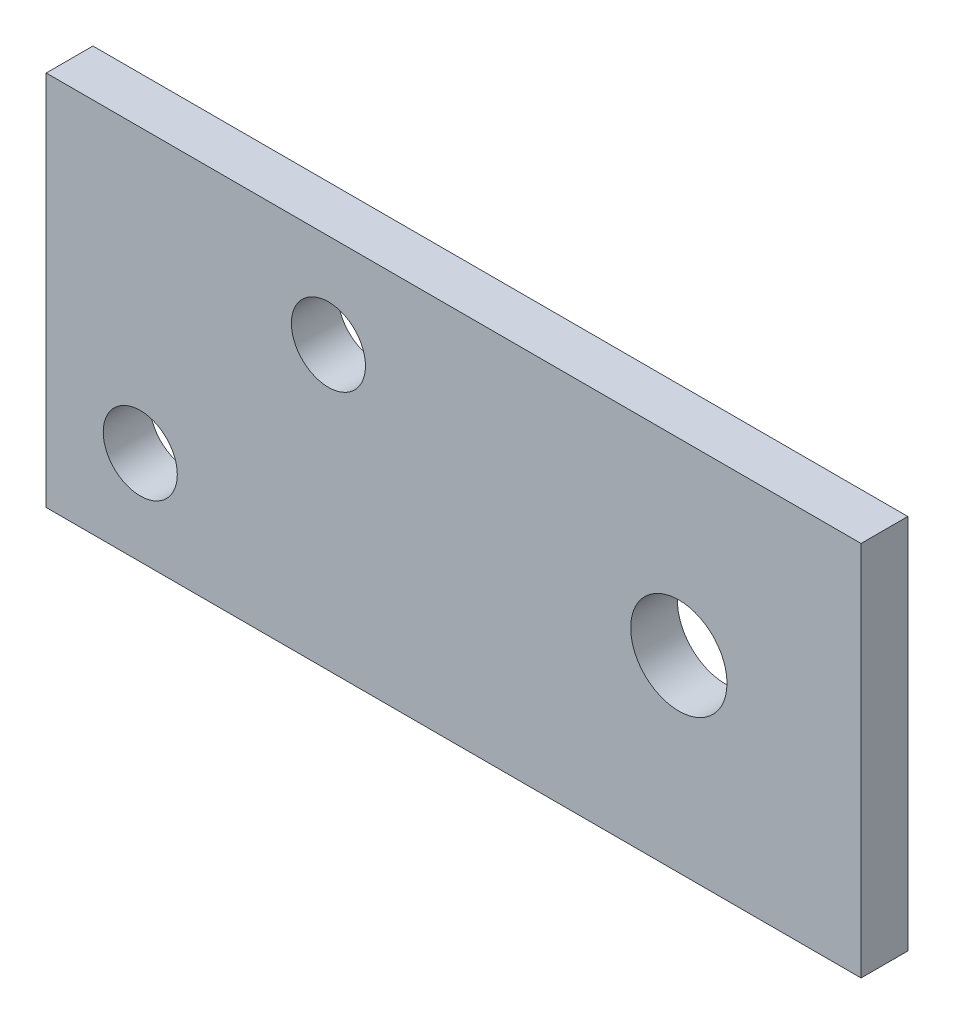
ISO-10303-21;
HEADER;
FILE_DESCRIPTION(('STEP AP214'),'2;1');
FILE_NAME('part.step','',(''),(''),'','','');
FILE_SCHEMA(('AUTOMOTIVE_DESIGN { 1 0 10303 214 1 1 1 1 }'));
ENDSEC;
DATA;
#1=APPLICATION_CONTEXT('core data for automotive mechanical design processes');
#2=APPLICATION_PROTOCOL_DEFINITION('international standard','automotive_design',2000,#1);
#3=PRODUCT_CONTEXT('',#1,'mechanical');
#4=PRODUCT('Part','Part','',(#3));
#5=PRODUCT_RELATED_PRODUCT_CATEGORY('part','',(#4));
#6=PRODUCT_DEFINITION_FORMATION('','',#4);
#7=PRODUCT_DEFINITION_CONTEXT('part definition',#1,'design');
#8=PRODUCT_DEFINITION('design','',#6,#7);
#9=PRODUCT_DEFINITION_SHAPE('','',#8);
#10=(LENGTH_UNIT() NAMED_UNIT(*) SI_UNIT(.MILLI.,.METRE.));
#11=(NAMED_UNIT(*) PLANE_ANGLE_UNIT() SI_UNIT($,.RADIAN.));
#12=(NAMED_UNIT(*) SI_UNIT($,.STERADIAN.) SOLID_ANGLE_UNIT());
#13=UNCERTAINTY_MEASURE_WITH_UNIT(LENGTH_MEASURE(1.E-05),#10,'distance_accuracy_value','');
#14=(GEOMETRIC_REPRESENTATION_CONTEXT(3) GLOBAL_UNCERTAINTY_ASSIGNED_CONTEXT((#13)) GLOBAL_UNIT_ASSIGNED_CONTEXT((#10,
#11,#12)) REPRESENTATION_CONTEXT('',''));
#15=CARTESIAN_POINT('',(0.,0.,0.));
#16=DIRECTION('',(0.,0.,1.));
#17=DIRECTION('',(1.,0.,0.));
#18=AXIS2_PLACEMENT_3D('',#15,#16,#17);
#19=CARTESIAN_POINT('',(0.,0.,6.31));
#20=DIRECTION('',(0.,0.,1.));
#21=DIRECTION('',(1.,0.,0.));
#22=AXIS2_PLACEMENT_3D('',#19,#20,#21);
#23=PLANE('',#22);
#24=CARTESIAN_POINT('',(-71.9,38.1,6.31));
#25=DIRECTION('',(0.,0.,1.));
#26=DIRECTION('',(1.,0.,0.));
#27=AXIS2_PLACEMENT_3D('',#24,#25,#26);
#28=CIRCLE('',#27,5.00000000000001);
#29=CARTESIAN_POINT('',(-66.9,38.1,6.31));
#30=VERTEX_POINT('',#29);
#31=EDGE_CURVE('E126',#30,#30,#28,.T.);
#32=ORIENTED_EDGE('',*,*,#31,.F.);
#33=EDGE_LOOP('',(#32));
#34=FACE_BOUND('',#33,.T.);
#35=CARTESIAN_POINT('',(-97.3,12.7,6.31));
#36=DIRECTION('',(0.,0.,1.));
#37=DIRECTION('',(1.,0.,0.));
#38=AXIS2_PLACEMENT_3D('',#35,#36,#37);
#39=CIRCLE('',#38,5.);
#40=CARTESIAN_POINT('',(-92.3,12.7,6.31));
#41=VERTEX_POINT('',#40);
#42=EDGE_CURVE('E116',#41,#41,#39,.T.);
#43=ORIENTED_EDGE('',*,*,#42,.F.);
#44=EDGE_LOOP('',(#43));
#45=FACE_BOUND('',#44,.T.);
#46=DIRECTION('',(-1.,0.,0.));
#47=VECTOR('',#46,1.);
#48=CARTESIAN_POINT('',(0.,50.8,6.31));
#49=LINE('',#48,#47);
#50=CARTESIAN_POINT('',(0.,50.8,6.31));
#51=VERTEX_POINT('',#50);
#52=CARTESIAN_POINT('',(-110.,50.8,6.31));
#53=VERTEX_POINT('',#52);
#54=EDGE_CURVE('E78',#51,#53,#49,.T.);
#55=ORIENTED_EDGE('',*,*,#54,.T.);
#56=DIRECTION('',(0.,-1.,0.));
#57=VECTOR('',#56,1.);
#58=CARTESIAN_POINT('',(-110.,50.8,6.31));
#59=LINE('',#58,#57);
#60=CARTESIAN_POINT('',(-110.,0.,6.31));
#61=VERTEX_POINT('',#60);
#62=EDGE_CURVE('E81',#53,#61,#59,.T.);
#63=ORIENTED_EDGE('',*,*,#62,.T.);
#64=DIRECTION('',(1.,0.,0.));
#65=VECTOR('',#64,1.);
#66=CARTESIAN_POINT('',(-110.,0.,6.31));
#67=LINE('',#66,#65);
#68=CARTESIAN_POINT('',(0.,0.,6.31));
#69=VERTEX_POINT('',#68);
#70=EDGE_CURVE('E85',#61,#69,#67,.T.);
#71=ORIENTED_EDGE('',*,*,#70,.T.);
#72=DIRECTION('',(0.,1.,0.));
#73=VECTOR('',#72,1.);
#74=CARTESIAN_POINT('',(0.,0.,6.31));
#75=LINE('',#74,#73);
#76=EDGE_CURVE('E49',#69,#51,#75,.T.);
#77=ORIENTED_EDGE('',*,*,#76,.T.);
#78=EDGE_LOOP('',(#55,#63,#71,#77));
#79=FACE_BOUND('',#78,.T.);
#80=CARTESIAN_POINT('',(-24.5999999998908,25.4013417539825,6.31));
#81=DIRECTION('',(0.,0.,1.));
#82=DIRECTION('',(1.,0.,0.));
#83=AXIS2_PLACEMENT_3D('',#80,#81,#82);
#84=CIRCLE('',#83,6.50134175398248);
#85=CARTESIAN_POINT('',(-18.0986582459083,25.4013417539825,6.31));
#86=VERTEX_POINT('',#85);
#87=EDGE_CURVE('E98',#86,#86,#84,.T.);
#88=ORIENTED_EDGE('',*,*,#87,.F.);
#89=EDGE_LOOP('',(#88));
#90=FACE_BOUND('',#89,.T.);
#91=ADVANCED_FACE('F32',(#34,#45,#79,#90),#23,.T.);
#92=CARTESIAN_POINT('',(0.,0.,0.));
#93=DIRECTION('',(0.,0.,1.));
#94=DIRECTION('',(1.,0.,0.));
#95=AXIS2_PLACEMENT_3D('',#92,#93,#94);
#96=PLANE('',#95);
#97=CARTESIAN_POINT('',(-71.9,38.1,0.));
#98=DIRECTION('',(0.,0.,-1.));
#99=DIRECTION('',(-1.,0.,0.));
#100=AXIS2_PLACEMENT_3D('',#97,#98,#99);
#101=CIRCLE('',#100,5.00000000000001);
#102=CARTESIAN_POINT('',(-76.9,38.1,0.));
#103=VERTEX_POINT('',#102);
#104=EDGE_CURVE('E129',#103,#103,#101,.T.);
#105=ORIENTED_EDGE('',*,*,#104,.F.);
#106=EDGE_LOOP('',(#105));
#107=FACE_BOUND('',#106,.T.);
#108=CARTESIAN_POINT('',(-97.3,12.7,0.));
#109=DIRECTION('',(0.,0.,-1.));
#110=DIRECTION('',(-1.,0.,0.));
#111=AXIS2_PLACEMENT_3D('',#108,#109,#110);
#112=CIRCLE('',#111,5.);
#113=CARTESIAN_POINT('',(-102.3,12.7,0.));
#114=VERTEX_POINT('',#113);
#115=EDGE_CURVE('E121',#114,#114,#112,.T.);
#116=ORIENTED_EDGE('',*,*,#115,.F.);
#117=EDGE_LOOP('',(#116));
#118=FACE_BOUND('',#117,.T.);
#119=DIRECTION('',(-1.,0.,0.));
#120=VECTOR('',#119,1.);
#121=CARTESIAN_POINT('',(-59.2,50.8,0.));
#122=LINE('',#121,#120);
#123=CARTESIAN_POINT('',(0.,50.8,0.));
#124=VERTEX_POINT('',#123);
#125=CARTESIAN_POINT('',(-110.,50.8,0.));
#126=VERTEX_POINT('',#125);
#127=EDGE_CURVE('E73',#124,#126,#122,.T.);
#128=ORIENTED_EDGE('',*,*,#127,.F.);
#129=DIRECTION('',(0.,1.,0.));
#130=VECTOR('',#129,1.);
#131=CARTESIAN_POINT('',(0.,0.,0.));
#132=LINE('',#131,#130);
#133=CARTESIAN_POINT('',(0.,0.,0.));
#134=VERTEX_POINT('',#133);
#135=EDGE_CURVE('E101',#134,#124,#132,.T.);
#136=ORIENTED_EDGE('',*,*,#135,.F.);
#137=DIRECTION('',(1.,0.,0.));
#138=VECTOR('',#137,1.);
#139=CARTESIAN_POINT('',(-110.,0.,0.));
#140=LINE('',#139,#138);
#141=CARTESIAN_POINT('',(-110.,0.,0.));
#142=VERTEX_POINT('',#141);
#143=EDGE_CURVE('E66',#142,#134,#140,.T.);
#144=ORIENTED_EDGE('',*,*,#143,.F.);
#145=DIRECTION('',(0.,-1.,0.));
#146=VECTOR('',#145,1.);
#147=CARTESIAN_POINT('',(-110.,50.8,0.));
#148=LINE('',#147,#146);
#149=EDGE_CURVE('E89',#126,#142,#148,.T.);
#150=ORIENTED_EDGE('',*,*,#149,.F.);
#151=EDGE_LOOP('',(#128,#136,#144,#150));
#152=FACE_BOUND('',#151,.T.);
#153=CARTESIAN_POINT('',(-24.5999999998908,25.4013417539825,0.));
#154=DIRECTION('',(0.,0.,1.));
#155=DIRECTION('',(1.,0.,0.));
#156=AXIS2_PLACEMENT_3D('',#153,#154,#155);
#157=CIRCLE('',#156,6.50134175398248);
#158=CARTESIAN_POINT('',(-18.0986582459083,25.4013417539825,0.));
#159=VERTEX_POINT('',#158);
#160=EDGE_CURVE('E114',#159,#159,#157,.T.);
#161=ORIENTED_EDGE('',*,*,#160,.T.);
#162=EDGE_LOOP('',(#161));
#163=FACE_BOUND('',#162,.T.);
#164=ADVANCED_FACE('F107',(#107,#118,#152,#163),#96,.F.);
#165=CARTESIAN_POINT('',(-59.2,50.8,6.31));
#166=DIRECTION('',(0.,-1.,0.));
#167=DIRECTION('',(1.,0.,0.));
#168=AXIS2_PLACEMENT_3D('',#165,#166,#167);
#169=PLANE('',#168);
#170=ORIENTED_EDGE('',*,*,#127,.T.);
#171=DIRECTION('',(0.,0.,-1.));
#172=VECTOR('',#171,1.);
#173=CARTESIAN_POINT('',(-110.,50.8,6.31));
#174=LINE('',#173,#172);
#175=EDGE_CURVE('E11',#53,#126,#174,.T.);
#176=ORIENTED_EDGE('',*,*,#175,.F.);
#177=ORIENTED_EDGE('',*,*,#54,.F.);
#178=DIRECTION('',(0.,0.,-1.));
#179=VECTOR('',#178,1.);
#180=CARTESIAN_POINT('',(0.,50.8,6.31));
#181=LINE('',#180,#179);
#182=EDGE_CURVE('E93',#51,#124,#181,.T.);
#183=ORIENTED_EDGE('',*,*,#182,.T.);
#184=EDGE_LOOP('',(#170,#176,#177,#183));
#185=FACE_BOUND('',#184,.T.);
#186=ADVANCED_FACE('F34',(#185),#169,.F.);
#187=CARTESIAN_POINT('',(-110.,50.8,6.31));
#188=DIRECTION('',(1.,0.,0.));
#189=DIRECTION('',(0.,0.,-1.));
#190=AXIS2_PLACEMENT_3D('',#187,#188,#189);
#191=PLANE('',#190);
#192=ORIENTED_EDGE('',*,*,#149,.T.);
#193=DIRECTION('',(0.,0.,-1.));
#194=VECTOR('',#193,1.);
#195=CARTESIAN_POINT('',(-110.,0.,6.31));
#196=LINE('',#195,#194);
#197=EDGE_CURVE('E41',#61,#142,#196,.T.);
#198=ORIENTED_EDGE('',*,*,#197,.F.);
#199=ORIENTED_EDGE('',*,*,#62,.F.);
#200=ORIENTED_EDGE('',*,*,#175,.T.);
#201=EDGE_LOOP('',(#192,#198,#199,#200));
#202=FACE_BOUND('',#201,.T.);
#203=ADVANCED_FACE('F88',(#202),#191,.F.);
#204=CARTESIAN_POINT('',(-110.,0.,6.31));
#205=DIRECTION('',(0.,1.,0.));
#206=DIRECTION('',(0.,0.,1.));
#207=AXIS2_PLACEMENT_3D('',#204,#205,#206);
#208=PLANE('',#207);
#209=ORIENTED_EDGE('',*,*,#143,.T.);
#210=DIRECTION('',(0.,0.,-1.));
#211=VECTOR('',#210,1.);
#212=CARTESIAN_POINT('',(0.,0.,6.31));
#213=LINE('',#212,#211);
#214=EDGE_CURVE('E90',#69,#134,#213,.T.);
#215=ORIENTED_EDGE('',*,*,#214,.F.);
#216=ORIENTED_EDGE('',*,*,#70,.F.);
#217=ORIENTED_EDGE('',*,*,#197,.T.);
#218=EDGE_LOOP('',(#209,#215,#216,#217));
#219=FACE_BOUND('',#218,.T.);
#220=ADVANCED_FACE('F91',(#219),#208,.F.);
#221=CARTESIAN_POINT('',(0.,0.,6.31));
#222=DIRECTION('',(-1.,0.,0.));
#223=DIRECTION('',(0.,0.,1.));
#224=AXIS2_PLACEMENT_3D('',#221,#222,#223);
#225=PLANE('',#224);
#226=ORIENTED_EDGE('',*,*,#135,.T.);
#227=ORIENTED_EDGE('',*,*,#182,.F.);
#228=ORIENTED_EDGE('',*,*,#76,.F.);
#229=ORIENTED_EDGE('',*,*,#214,.T.);
#230=EDGE_LOOP('',(#226,#227,#228,#229));
#231=FACE_BOUND('',#230,.T.);
#232=ADVANCED_FACE('F106',(#231),#225,.F.);
#233=CARTESIAN_POINT('',(-24.5999999998908,25.4013417539825,6.31));
#234=DIRECTION('',(0.,0.,-1.));
#235=DIRECTION('',(-1.,0.,0.));
#236=AXIS2_PLACEMENT_3D('',#233,#234,#235);
#237=CYLINDRICAL_SURFACE('',#236,6.50134175398248);
#238=ORIENTED_EDGE('',*,*,#87,.T.);
#239=EDGE_LOOP('',(#238));
#240=FACE_BOUND('',#239,.T.);
#241=ORIENTED_EDGE('',*,*,#160,.F.);
#242=EDGE_LOOP('',(#241));
#243=FACE_BOUND('',#242,.T.);
#244=ADVANCED_FACE('F139',(#240,#243),#237,.F.);
#245=CARTESIAN_POINT('',(-97.3,12.7,10.));
#246=DIRECTION('',(0.,0.,-1.));
#247=DIRECTION('',(-1.,0.,0.));
#248=AXIS2_PLACEMENT_3D('',#245,#246,#247);
#249=CYLINDRICAL_SURFACE('',#248,5.);
#250=ORIENTED_EDGE('',*,*,#42,.T.);
#251=EDGE_LOOP('',(#250));
#252=FACE_BOUND('',#251,.T.);
#253=ORIENTED_EDGE('',*,*,#115,.T.);
#254=EDGE_LOOP('',(#253));
#255=FACE_BOUND('',#254,.T.);
#256=ADVANCED_FACE('F137',(#252,#255),#249,.F.);
#257=CARTESIAN_POINT('',(-71.9,38.1,10.));
#258=DIRECTION('',(0.,0.,-1.));
#259=DIRECTION('',(-1.,0.,0.));
#260=AXIS2_PLACEMENT_3D('',#257,#258,#259);
#261=CYLINDRICAL_SURFACE('',#260,5.00000000000001);
#262=ORIENTED_EDGE('',*,*,#31,.T.);
#263=EDGE_LOOP('',(#262));
#264=FACE_BOUND('',#263,.T.);
#265=ORIENTED_EDGE('',*,*,#104,.T.);
#266=EDGE_LOOP('',(#265));
#267=FACE_BOUND('',#266,.T.);
#268=ADVANCED_FACE('F133',(#264,#267),#261,.F.);
#269=CLOSED_SHELL('',(#91,#164,#186,#203,#220,#232,#244,#256,#268));
#270=MANIFOLD_SOLID_BREP('B2',#269);
#271=ADVANCED_BREP_SHAPE_REPRESENTATION('',(#18,#270),#14);
#272=SHAPE_DEFINITION_REPRESENTATION(#9,#271);
ENDSEC;
END-ISO-10303-21;
